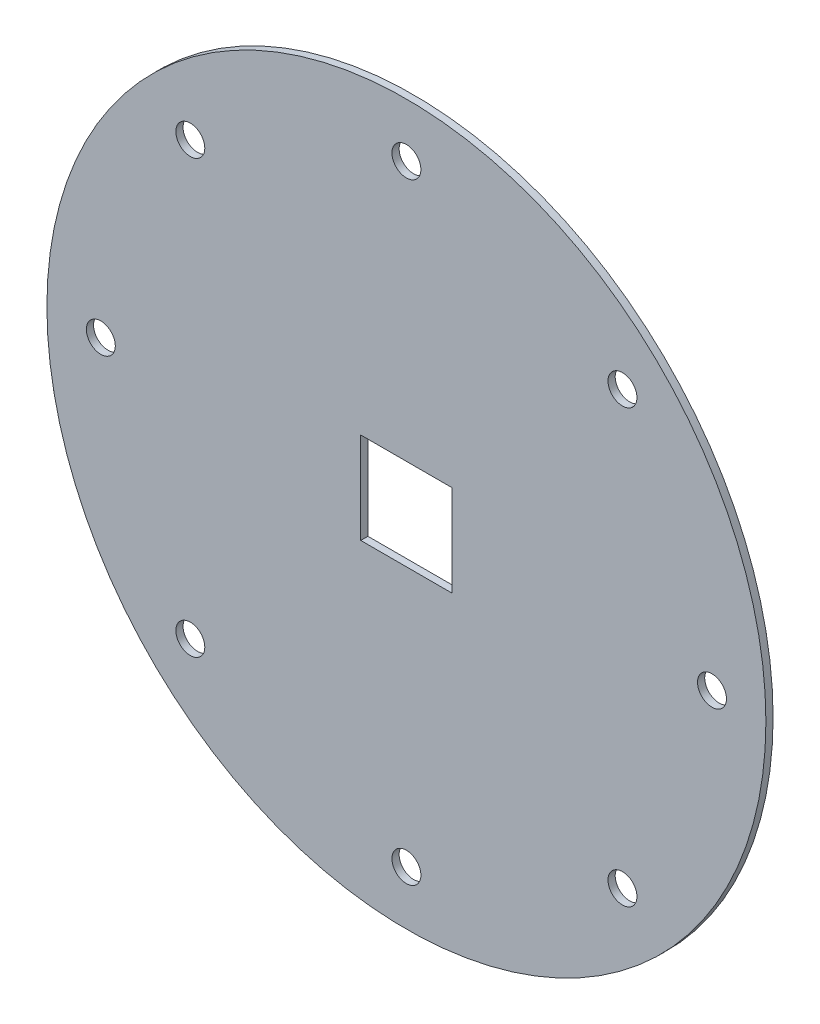
ISO-10303-21;
HEADER;
FILE_DESCRIPTION(('STEP AP214'),'2;1');
FILE_NAME('part.step','',(''),(''),'','','');
FILE_SCHEMA(('AUTOMOTIVE_DESIGN { 1 0 10303 214 1 1 1 1 }'));
ENDSEC;
DATA;
#1=APPLICATION_CONTEXT('core data for automotive mechanical design processes');
#2=APPLICATION_PROTOCOL_DEFINITION('international standard','automotive_design',2000,#1);
#3=PRODUCT_CONTEXT('',#1,'mechanical');
#4=PRODUCT('Part','Part','',(#3));
#5=PRODUCT_RELATED_PRODUCT_CATEGORY('part','',(#4));
#6=PRODUCT_DEFINITION_FORMATION('','',#4);
#7=PRODUCT_DEFINITION_CONTEXT('part definition',#1,'design');
#8=PRODUCT_DEFINITION('design','',#6,#7);
#9=PRODUCT_DEFINITION_SHAPE('','',#8);
#10=(LENGTH_UNIT() NAMED_UNIT(*) SI_UNIT(.MILLI.,.METRE.));
#11=(NAMED_UNIT(*) PLANE_ANGLE_UNIT() SI_UNIT($,.RADIAN.));
#12=(NAMED_UNIT(*) SI_UNIT($,.STERADIAN.) SOLID_ANGLE_UNIT());
#13=UNCERTAINTY_MEASURE_WITH_UNIT(LENGTH_MEASURE(1.E-05),#10,'distance_accuracy_value','');
#14=(GEOMETRIC_REPRESENTATION_CONTEXT(3) GLOBAL_UNCERTAINTY_ASSIGNED_CONTEXT((#13)) GLOBAL_UNIT_ASSIGNED_CONTEXT((#10,
#11,#12)) REPRESENTATION_CONTEXT('',''));
#15=CARTESIAN_POINT('',(0.,0.,0.));
#16=DIRECTION('',(0.,0.,1.));
#17=DIRECTION('',(1.,0.,0.));
#18=AXIS2_PLACEMENT_3D('',#15,#16,#17);
#19=CARTESIAN_POINT('',(0.,0.,2.));
#20=DIRECTION('',(0.,0.,1.));
#21=DIRECTION('',(1.,0.,0.));
#22=AXIS2_PLACEMENT_3D('',#19,#20,#21);
#23=PLANE('',#22);
#24=CARTESIAN_POINT('',(-84.9999999999928,-7.24233115585665E-12,2.));
#25=DIRECTION('',(0.,0.,1.));
#26=DIRECTION('',(1.,0.,0.));
#27=AXIS2_PLACEMENT_3D('',#24,#25,#26);
#28=CIRCLE('',#27,4.025);
#29=CARTESIAN_POINT('',(-80.9749999999928,-7.24233115585665E-12,2.));
#30=VERTEX_POINT('',#29);
#31=EDGE_CURVE('E166',#30,#30,#28,.T.);
#32=ORIENTED_EDGE('',*,*,#31,.F.);
#33=EDGE_LOOP('',(#32));
#34=FACE_BOUND('',#33,.T.);
#35=CARTESIAN_POINT('',(1.44638433161278E-11,-85.,2.));
#36=DIRECTION('',(0.,0.,1.));
#37=DIRECTION('',(1.,0.,0.));
#38=AXIS2_PLACEMENT_3D('',#35,#36,#37);
#39=CIRCLE('',#38,4.025);
#40=CARTESIAN_POINT('',(4.02500000001446,-85.,2.));
#41=VERTEX_POINT('',#40);
#42=EDGE_CURVE('E170',#41,#41,#39,.T.);
#43=ORIENTED_EDGE('',*,*,#42,.F.);
#44=EDGE_LOOP('',(#43));
#45=FACE_BOUND('',#44,.T.);
#46=CARTESIAN_POINT('',(85.0000000000072,7.23192165806389E-12,2.));
#47=DIRECTION('',(0.,0.,1.));
#48=DIRECTION('',(1.,0.,0.));
#49=AXIS2_PLACEMENT_3D('',#46,#47,#48);
#50=CIRCLE('',#49,4.025);
#51=CARTESIAN_POINT('',(89.0250000000072,7.23192165806389E-12,2.));
#52=VERTEX_POINT('',#51);
#53=EDGE_CURVE('E173',#52,#52,#50,.T.);
#54=ORIENTED_EDGE('',*,*,#53,.F.);
#55=EDGE_LOOP('',(#54));
#56=FACE_BOUND('',#55,.T.);
#57=DIRECTION('',(1.,0.,0.));
#58=VECTOR('',#57,1.);
#59=CARTESIAN_POINT('',(-12.7,-12.7,2.));
#60=LINE('',#59,#58);
#61=CARTESIAN_POINT('',(-12.7,-12.7,2.));
#62=VERTEX_POINT('',#61);
#63=CARTESIAN_POINT('',(12.7,-12.7,2.));
#64=VERTEX_POINT('',#63);
#65=EDGE_CURVE('E94',#62,#64,#60,.T.);
#66=ORIENTED_EDGE('',*,*,#65,.F.);
#67=DIRECTION('',(0.,-1.,0.));
#68=VECTOR('',#67,1.);
#69=CARTESIAN_POINT('',(-12.7,12.7,2.));
#70=LINE('',#69,#68);
#71=CARTESIAN_POINT('',(-12.7,12.7,2.));
#72=VERTEX_POINT('',#71);
#73=EDGE_CURVE('E85',#72,#62,#70,.T.);
#74=ORIENTED_EDGE('',*,*,#73,.F.);
#75=DIRECTION('',(-1.,0.,0.));
#76=VECTOR('',#75,1.);
#77=CARTESIAN_POINT('',(-12.7,12.7,2.));
#78=LINE('',#77,#76);
#79=CARTESIAN_POINT('',(12.7,12.7,2.));
#80=VERTEX_POINT('',#79);
#81=EDGE_CURVE('E112',#80,#72,#78,.T.);
#82=ORIENTED_EDGE('',*,*,#81,.F.);
#83=DIRECTION('',(0.,1.,0.));
#84=VECTOR('',#83,1.);
#85=CARTESIAN_POINT('',(12.7,12.7,2.));
#86=LINE('',#85,#84);
#87=EDGE_CURVE('E108',#64,#80,#86,.T.);
#88=ORIENTED_EDGE('',*,*,#87,.F.);
#89=EDGE_LOOP('',(#66,#74,#82,#88));
#90=FACE_BOUND('',#89,.T.);
#91=CARTESIAN_POINT('',(0.,85.,2.));
#92=DIRECTION('',(0.,0.,1.));
#93=DIRECTION('',(1.,0.,0.));
#94=AXIS2_PLACEMENT_3D('',#91,#92,#93);
#95=CIRCLE('',#94,4.025);
#96=CARTESIAN_POINT('',(4.025,85.,2.));
#97=VERTEX_POINT('',#96);
#98=EDGE_CURVE('E136',#97,#97,#95,.T.);
#99=ORIENTED_EDGE('',*,*,#98,.F.);
#100=EDGE_LOOP('',(#99));
#101=FACE_BOUND('',#100,.T.);
#102=CARTESIAN_POINT('',(0.,0.,2.));
#103=DIRECTION('',(0.,0.,1.));
#104=DIRECTION('',(1.,0.,0.));
#105=AXIS2_PLACEMENT_3D('',#102,#103,#104);
#106=CIRCLE('',#105,100.);
#107=CARTESIAN_POINT('',(100.,0.,2.));
#108=VERTEX_POINT('',#107);
#109=EDGE_CURVE('E11',#108,#108,#106,.T.);
#110=ORIENTED_EDGE('',*,*,#109,.T.);
#111=EDGE_LOOP('',(#110));
#112=FACE_BOUND('',#111,.T.);
#113=CARTESIAN_POINT('',(60.1040764008587,60.1040764008617,2.));
#114=DIRECTION('',(0.,0.,1.));
#115=DIRECTION('',(1.,0.,0.));
#116=AXIS2_PLACEMENT_3D('',#113,#114,#115);
#117=CIRCLE('',#116,4.025);
#118=CARTESIAN_POINT('',(64.1290764008587,60.1040764008617,2.));
#119=VERTEX_POINT('',#118);
#120=EDGE_CURVE('E120',#119,#119,#117,.T.);
#121=ORIENTED_EDGE('',*,*,#120,.F.);
#122=EDGE_LOOP('',(#121));
#123=FACE_BOUND('',#122,.T.);
#124=CARTESIAN_POINT('',(60.1040764008689,-60.1040764008514,2.));
#125=DIRECTION('',(0.,0.,1.));
#126=DIRECTION('',(1.,0.,0.));
#127=AXIS2_PLACEMENT_3D('',#124,#125,#126);
#128=CIRCLE('',#127,4.025);
#129=CARTESIAN_POINT('',(64.1290764008689,-60.1040764008514,2.));
#130=VERTEX_POINT('',#129);
#131=EDGE_CURVE('E183',#130,#130,#128,.T.);
#132=ORIENTED_EDGE('',*,*,#131,.F.);
#133=EDGE_LOOP('',(#132));
#134=FACE_BOUND('',#133,.T.);
#135=CARTESIAN_POINT('',(-60.1040764008442,-60.1040764008617,2.));
#136=DIRECTION('',(0.,0.,1.));
#137=DIRECTION('',(1.,0.,0.));
#138=AXIS2_PLACEMENT_3D('',#135,#136,#137);
#139=CIRCLE('',#138,4.025);
#140=CARTESIAN_POINT('',(-56.0790764008442,-60.1040764008617,2.));
#141=VERTEX_POINT('',#140);
#142=EDGE_CURVE('E203',#141,#141,#139,.T.);
#143=ORIENTED_EDGE('',*,*,#142,.F.);
#144=EDGE_LOOP('',(#143));
#145=FACE_BOUND('',#144,.T.);
#146=CARTESIAN_POINT('',(-60.1040764008544,60.1040764008514,2.));
#147=DIRECTION('',(0.,0.,1.));
#148=DIRECTION('',(1.,0.,0.));
#149=AXIS2_PLACEMENT_3D('',#146,#147,#148);
#150=CIRCLE('',#149,4.025);
#151=CARTESIAN_POINT('',(-56.0790764008544,60.1040764008514,2.));
#152=VERTEX_POINT('',#151);
#153=EDGE_CURVE('E206',#152,#152,#150,.T.);
#154=ORIENTED_EDGE('',*,*,#153,.F.);
#155=EDGE_LOOP('',(#154));
#156=FACE_BOUND('',#155,.T.);
#157=ADVANCED_FACE('F43',(#34,#45,#56,#90,#101,#112,#123,#134,#145,#156),#23,.T.);
#158=CARTESIAN_POINT('',(0.,0.,0.));
#159=DIRECTION('',(0.,0.,1.));
#160=DIRECTION('',(1.,0.,0.));
#161=AXIS2_PLACEMENT_3D('',#158,#159,#160);
#162=PLANE('',#161);
#163=CARTESIAN_POINT('',(0.,85.,0.));
#164=DIRECTION('',(0.,0.,1.));
#165=DIRECTION('',(1.,0.,0.));
#166=AXIS2_PLACEMENT_3D('',#163,#164,#165);
#167=CIRCLE('',#166,4.025);
#168=CARTESIAN_POINT('',(4.025,85.,0.));
#169=VERTEX_POINT('',#168);
#170=EDGE_CURVE('E103',#169,#169,#167,.T.);
#171=ORIENTED_EDGE('',*,*,#170,.T.);
#172=EDGE_LOOP('',(#171));
#173=FACE_BOUND('',#172,.T.);
#174=CARTESIAN_POINT('',(0.,0.,0.));
#175=DIRECTION('',(0.,0.,1.));
#176=DIRECTION('',(1.,0.,0.));
#177=AXIS2_PLACEMENT_3D('',#174,#175,#176);
#178=CIRCLE('',#177,100.);
#179=CARTESIAN_POINT('',(100.,0.,0.));
#180=VERTEX_POINT('',#179);
#181=EDGE_CURVE('E47',#180,#180,#178,.T.);
#182=ORIENTED_EDGE('',*,*,#181,.F.);
#183=EDGE_LOOP('',(#182));
#184=FACE_BOUND('',#183,.T.);
#185=DIRECTION('',(0.,-1.,0.));
#186=VECTOR('',#185,1.);
#187=CARTESIAN_POINT('',(-12.7,12.7,0.));
#188=LINE('',#187,#186);
#189=CARTESIAN_POINT('',(-12.7,12.7,0.));
#190=VERTEX_POINT('',#189);
#191=CARTESIAN_POINT('',(-12.7,-12.7,0.));
#192=VERTEX_POINT('',#191);
#193=EDGE_CURVE('E67',#190,#192,#188,.T.);
#194=ORIENTED_EDGE('',*,*,#193,.T.);
#195=DIRECTION('',(1.,0.,0.));
#196=VECTOR('',#195,1.);
#197=CARTESIAN_POINT('',(-12.7,-12.7,0.));
#198=LINE('',#197,#196);
#199=CARTESIAN_POINT('',(12.7,-12.7,0.));
#200=VERTEX_POINT('',#199);
#201=EDGE_CURVE('E101',#192,#200,#198,.T.);
#202=ORIENTED_EDGE('',*,*,#201,.T.);
#203=DIRECTION('',(0.,1.,0.));
#204=VECTOR('',#203,1.);
#205=CARTESIAN_POINT('',(12.7,12.7,0.));
#206=LINE('',#205,#204);
#207=CARTESIAN_POINT('',(12.7,12.7,0.));
#208=VERTEX_POINT('',#207);
#209=EDGE_CURVE('E123',#200,#208,#206,.T.);
#210=ORIENTED_EDGE('',*,*,#209,.T.);
#211=DIRECTION('',(-1.,0.,0.));
#212=VECTOR('',#211,1.);
#213=CARTESIAN_POINT('',(-12.7,12.7,0.));
#214=LINE('',#213,#212);
#215=EDGE_CURVE('E95',#208,#190,#214,.T.);
#216=ORIENTED_EDGE('',*,*,#215,.T.);
#217=EDGE_LOOP('',(#194,#202,#210,#216));
#218=FACE_BOUND('',#217,.T.);
#219=CARTESIAN_POINT('',(60.1040764008587,60.1040764008617,0.));
#220=DIRECTION('',(0.,0.,1.));
#221=DIRECTION('',(1.,0.,0.));
#222=AXIS2_PLACEMENT_3D('',#219,#220,#221);
#223=CIRCLE('',#222,4.025);
#224=CARTESIAN_POINT('',(64.1290764008587,60.1040764008617,0.));
#225=VERTEX_POINT('',#224);
#226=EDGE_CURVE('E176',#225,#225,#223,.T.);
#227=ORIENTED_EDGE('',*,*,#226,.T.);
#228=EDGE_LOOP('',(#227));
#229=FACE_BOUND('',#228,.T.);
#230=CARTESIAN_POINT('',(85.0000000000072,7.23192165806389E-12,0.));
#231=DIRECTION('',(0.,0.,1.));
#232=DIRECTION('',(1.,0.,0.));
#233=AXIS2_PLACEMENT_3D('',#230,#231,#232);
#234=CIRCLE('',#233,4.025);
#235=CARTESIAN_POINT('',(89.0250000000072,7.23192165806389E-12,0.));
#236=VERTEX_POINT('',#235);
#237=EDGE_CURVE('E177',#236,#236,#234,.T.);
#238=ORIENTED_EDGE('',*,*,#237,.T.);
#239=EDGE_LOOP('',(#238));
#240=FACE_BOUND('',#239,.T.);
#241=CARTESIAN_POINT('',(60.1040764008689,-60.1040764008514,0.));
#242=DIRECTION('',(0.,0.,1.));
#243=DIRECTION('',(1.,0.,0.));
#244=AXIS2_PLACEMENT_3D('',#241,#242,#243);
#245=CIRCLE('',#244,4.025);
#246=CARTESIAN_POINT('',(64.1290764008689,-60.1040764008514,0.));
#247=VERTEX_POINT('',#246);
#248=EDGE_CURVE('E186',#247,#247,#245,.T.);
#249=ORIENTED_EDGE('',*,*,#248,.T.);
#250=EDGE_LOOP('',(#249));
#251=FACE_BOUND('',#250,.T.);
#252=CARTESIAN_POINT('',(1.44638433161278E-11,-85.,0.));
#253=DIRECTION('',(0.,0.,1.));
#254=DIRECTION('',(1.,0.,0.));
#255=AXIS2_PLACEMENT_3D('',#252,#253,#254);
#256=CIRCLE('',#255,4.025);
#257=CARTESIAN_POINT('',(4.02500000001446,-85.,0.));
#258=VERTEX_POINT('',#257);
#259=EDGE_CURVE('E224',#258,#258,#256,.T.);
#260=ORIENTED_EDGE('',*,*,#259,.T.);
#261=EDGE_LOOP('',(#260));
#262=FACE_BOUND('',#261,.T.);
#263=CARTESIAN_POINT('',(-60.1040764008442,-60.1040764008617,0.));
#264=DIRECTION('',(0.,0.,1.));
#265=DIRECTION('',(1.,0.,0.));
#266=AXIS2_PLACEMENT_3D('',#263,#264,#265);
#267=CIRCLE('',#266,4.025);
#268=CARTESIAN_POINT('',(-56.0790764008442,-60.1040764008617,0.));
#269=VERTEX_POINT('',#268);
#270=EDGE_CURVE('E220',#269,#269,#267,.T.);
#271=ORIENTED_EDGE('',*,*,#270,.T.);
#272=EDGE_LOOP('',(#271));
#273=FACE_BOUND('',#272,.T.);
#274=CARTESIAN_POINT('',(-84.9999999999928,-7.24233115585665E-12,0.));
#275=DIRECTION('',(0.,0.,1.));
#276=DIRECTION('',(1.,0.,0.));
#277=AXIS2_PLACEMENT_3D('',#274,#275,#276);
#278=CIRCLE('',#277,4.025);
#279=CARTESIAN_POINT('',(-80.9749999999928,-7.24233115585665E-12,0.));
#280=VERTEX_POINT('',#279);
#281=EDGE_CURVE('E209',#280,#280,#278,.T.);
#282=ORIENTED_EDGE('',*,*,#281,.T.);
#283=EDGE_LOOP('',(#282));
#284=FACE_BOUND('',#283,.T.);
#285=CARTESIAN_POINT('',(-60.1040764008544,60.1040764008514,0.));
#286=DIRECTION('',(0.,0.,1.));
#287=DIRECTION('',(1.,0.,0.));
#288=AXIS2_PLACEMENT_3D('',#285,#286,#287);
#289=CIRCLE('',#288,4.025);
#290=CARTESIAN_POINT('',(-56.0790764008544,60.1040764008514,0.));
#291=VERTEX_POINT('',#290);
#292=EDGE_CURVE('E210',#291,#291,#289,.T.);
#293=ORIENTED_EDGE('',*,*,#292,.T.);
#294=EDGE_LOOP('',(#293));
#295=FACE_BOUND('',#294,.T.);
#296=ADVANCED_FACE('F144',(#173,#184,#218,#229,#240,#251,#262,#273,#284,#295),#162,.F.);
#297=CARTESIAN_POINT('',(0.,0.,2.));
#298=DIRECTION('',(0.,0.,-1.));
#299=DIRECTION('',(-1.,0.,0.));
#300=AXIS2_PLACEMENT_3D('',#297,#298,#299);
#301=CYLINDRICAL_SURFACE('',#300,100.);
#302=ORIENTED_EDGE('',*,*,#109,.F.);
#303=EDGE_LOOP('',(#302));
#304=FACE_BOUND('',#303,.T.);
#305=ORIENTED_EDGE('',*,*,#181,.T.);
#306=EDGE_LOOP('',(#305));
#307=FACE_BOUND('',#306,.T.);
#308=ADVANCED_FACE('F45',(#304,#307),#301,.T.);
#309=CARTESIAN_POINT('',(0.,85.,2.));
#310=DIRECTION('',(0.,0.,-1.));
#311=DIRECTION('',(-1.,0.,0.));
#312=AXIS2_PLACEMENT_3D('',#309,#310,#311);
#313=CYLINDRICAL_SURFACE('',#312,4.025);
#314=ORIENTED_EDGE('',*,*,#98,.T.);
#315=EDGE_LOOP('',(#314));
#316=FACE_BOUND('',#315,.T.);
#317=ORIENTED_EDGE('',*,*,#170,.F.);
#318=EDGE_LOOP('',(#317));
#319=FACE_BOUND('',#318,.T.);
#320=ADVANCED_FACE('F147',(#316,#319),#313,.F.);
#321=CARTESIAN_POINT('',(-12.7,12.7,2.));
#322=DIRECTION('',(1.,0.,0.));
#323=DIRECTION('',(0.,1.,0.));
#324=AXIS2_PLACEMENT_3D('',#321,#322,#323);
#325=PLANE('',#324);
#326=ORIENTED_EDGE('',*,*,#193,.F.);
#327=DIRECTION('',(0.,0.,-1.));
#328=VECTOR('',#327,1.);
#329=CARTESIAN_POINT('',(-12.7,12.7,2.));
#330=LINE('',#329,#328);
#331=EDGE_CURVE('E89',#72,#190,#330,.T.);
#332=ORIENTED_EDGE('',*,*,#331,.F.);
#333=ORIENTED_EDGE('',*,*,#73,.T.);
#334=DIRECTION('',(0.,0.,-1.));
#335=VECTOR('',#334,1.);
#336=CARTESIAN_POINT('',(-12.7,-12.7,2.));
#337=LINE('',#336,#335);
#338=EDGE_CURVE('E88',#62,#192,#337,.T.);
#339=ORIENTED_EDGE('',*,*,#338,.T.);
#340=EDGE_LOOP('',(#326,#332,#333,#339));
#341=FACE_BOUND('',#340,.T.);
#342=ADVANCED_FACE('F87',(#341),#325,.T.);
#343=CARTESIAN_POINT('',(-12.7,-12.7,2.));
#344=DIRECTION('',(0.,1.,0.));
#345=DIRECTION('',(-1.,0.,0.));
#346=AXIS2_PLACEMENT_3D('',#343,#344,#345);
#347=PLANE('',#346);
#348=ORIENTED_EDGE('',*,*,#201,.F.);
#349=ORIENTED_EDGE('',*,*,#338,.F.);
#350=ORIENTED_EDGE('',*,*,#65,.T.);
#351=DIRECTION('',(0.,0.,-1.));
#352=VECTOR('',#351,1.);
#353=CARTESIAN_POINT('',(12.7,-12.7,2.));
#354=LINE('',#353,#352);
#355=EDGE_CURVE('E104',#64,#200,#354,.T.);
#356=ORIENTED_EDGE('',*,*,#355,.T.);
#357=EDGE_LOOP('',(#348,#349,#350,#356));
#358=FACE_BOUND('',#357,.T.);
#359=ADVANCED_FACE('F98',(#358),#347,.T.);
#360=CARTESIAN_POINT('',(12.7,12.7,2.));
#361=DIRECTION('',(-1.,0.,0.));
#362=DIRECTION('',(0.,0.,1.));
#363=AXIS2_PLACEMENT_3D('',#360,#361,#362);
#364=PLANE('',#363);
#365=ORIENTED_EDGE('',*,*,#209,.F.);
#366=ORIENTED_EDGE('',*,*,#355,.F.);
#367=ORIENTED_EDGE('',*,*,#87,.T.);
#368=DIRECTION('',(0.,0.,-1.));
#369=VECTOR('',#368,1.);
#370=CARTESIAN_POINT('',(12.7,12.7,2.));
#371=LINE('',#370,#369);
#372=EDGE_CURVE('E59',#80,#208,#371,.T.);
#373=ORIENTED_EDGE('',*,*,#372,.T.);
#374=EDGE_LOOP('',(#365,#366,#367,#373));
#375=FACE_BOUND('',#374,.T.);
#376=ADVANCED_FACE('F260',(#375),#364,.T.);
#377=CARTESIAN_POINT('',(-12.7,12.7,2.));
#378=DIRECTION('',(0.,-1.,0.));
#379=DIRECTION('',(1.,0.,0.));
#380=AXIS2_PLACEMENT_3D('',#377,#378,#379);
#381=PLANE('',#380);
#382=ORIENTED_EDGE('',*,*,#215,.F.);
#383=ORIENTED_EDGE('',*,*,#372,.F.);
#384=ORIENTED_EDGE('',*,*,#81,.T.);
#385=ORIENTED_EDGE('',*,*,#331,.T.);
#386=EDGE_LOOP('',(#382,#383,#384,#385));
#387=FACE_BOUND('',#386,.T.);
#388=ADVANCED_FACE('F257',(#387),#381,.T.);
#389=CARTESIAN_POINT('',(60.1040764008587,60.1040764008617,2.));
#390=DIRECTION('',(0.,0.,-1.));
#391=DIRECTION('',(-1.,0.,0.));
#392=AXIS2_PLACEMENT_3D('',#389,#390,#391);
#393=CYLINDRICAL_SURFACE('',#392,4.025);
#394=ORIENTED_EDGE('',*,*,#120,.T.);
#395=EDGE_LOOP('',(#394));
#396=FACE_BOUND('',#395,.T.);
#397=ORIENTED_EDGE('',*,*,#226,.F.);
#398=EDGE_LOOP('',(#397));
#399=FACE_BOUND('',#398,.T.);
#400=ADVANCED_FACE('F193',(#396,#399),#393,.F.);
#401=CARTESIAN_POINT('',(85.0000000000072,7.23192165806389E-12,2.));
#402=DIRECTION('',(0.,0.,-1.));
#403=DIRECTION('',(-1.,0.,0.));
#404=AXIS2_PLACEMENT_3D('',#401,#402,#403);
#405=CYLINDRICAL_SURFACE('',#404,4.025);
#406=ORIENTED_EDGE('',*,*,#53,.T.);
#407=EDGE_LOOP('',(#406));
#408=FACE_BOUND('',#407,.T.);
#409=ORIENTED_EDGE('',*,*,#237,.F.);
#410=EDGE_LOOP('',(#409));
#411=FACE_BOUND('',#410,.T.);
#412=ADVANCED_FACE('F243',(#408,#411),#405,.F.);
#413=CARTESIAN_POINT('',(60.1040764008689,-60.1040764008514,2.));
#414=DIRECTION('',(0.,0.,-1.));
#415=DIRECTION('',(-1.,0.,0.));
#416=AXIS2_PLACEMENT_3D('',#413,#414,#415);
#417=CYLINDRICAL_SURFACE('',#416,4.025);
#418=ORIENTED_EDGE('',*,*,#131,.T.);
#419=EDGE_LOOP('',(#418));
#420=FACE_BOUND('',#419,.T.);
#421=ORIENTED_EDGE('',*,*,#248,.F.);
#422=EDGE_LOOP('',(#421));
#423=FACE_BOUND('',#422,.T.);
#424=ADVANCED_FACE('F240',(#420,#423),#417,.F.);
#425=CARTESIAN_POINT('',(1.44638433161278E-11,-85.,2.));
#426=DIRECTION('',(0.,0.,-1.));
#427=DIRECTION('',(-1.,0.,0.));
#428=AXIS2_PLACEMENT_3D('',#425,#426,#427);
#429=CYLINDRICAL_SURFACE('',#428,4.025);
#430=ORIENTED_EDGE('',*,*,#42,.T.);
#431=EDGE_LOOP('',(#430));
#432=FACE_BOUND('',#431,.T.);
#433=ORIENTED_EDGE('',*,*,#259,.F.);
#434=EDGE_LOOP('',(#433));
#435=FACE_BOUND('',#434,.T.);
#436=ADVANCED_FACE('F242',(#432,#435),#429,.F.);
#437=CARTESIAN_POINT('',(-60.1040764008442,-60.1040764008617,2.));
#438=DIRECTION('',(0.,0.,-1.));
#439=DIRECTION('',(-1.,0.,0.));
#440=AXIS2_PLACEMENT_3D('',#437,#438,#439);
#441=CYLINDRICAL_SURFACE('',#440,4.025);
#442=ORIENTED_EDGE('',*,*,#142,.T.);
#443=EDGE_LOOP('',(#442));
#444=FACE_BOUND('',#443,.T.);
#445=ORIENTED_EDGE('',*,*,#270,.F.);
#446=EDGE_LOOP('',(#445));
#447=FACE_BOUND('',#446,.T.);
#448=ADVANCED_FACE('F249',(#444,#447),#441,.F.);
#449=CARTESIAN_POINT('',(-84.9999999999928,-7.24233115585665E-12,2.));
#450=DIRECTION('',(0.,0.,-1.));
#451=DIRECTION('',(-1.,0.,0.));
#452=AXIS2_PLACEMENT_3D('',#449,#450,#451);
#453=CYLINDRICAL_SURFACE('',#452,4.025);
#454=ORIENTED_EDGE('',*,*,#31,.T.);
#455=EDGE_LOOP('',(#454));
#456=FACE_BOUND('',#455,.T.);
#457=ORIENTED_EDGE('',*,*,#281,.F.);
#458=EDGE_LOOP('',(#457));
#459=FACE_BOUND('',#458,.T.);
#460=ADVANCED_FACE('F307',(#456,#459),#453,.F.);
#461=CARTESIAN_POINT('',(-60.1040764008544,60.1040764008514,2.));
#462=DIRECTION('',(0.,0.,-1.));
#463=DIRECTION('',(-1.,0.,0.));
#464=AXIS2_PLACEMENT_3D('',#461,#462,#463);
#465=CYLINDRICAL_SURFACE('',#464,4.025);
#466=ORIENTED_EDGE('',*,*,#153,.T.);
#467=EDGE_LOOP('',(#466));
#468=FACE_BOUND('',#467,.T.);
#469=ORIENTED_EDGE('',*,*,#292,.F.);
#470=EDGE_LOOP('',(#469));
#471=FACE_BOUND('',#470,.T.);
#472=ADVANCED_FACE('F317',(#468,#471),#465,.F.);
#473=CLOSED_SHELL('',(#157,#296,#308,#320,#342,#359,#376,#388,#400,#412,#424,#436,#448,#460,#472));
#474=MANIFOLD_SOLID_BREP('B2',#473);
#475=ADVANCED_BREP_SHAPE_REPRESENTATION('',(#18,#474),#14);
#476=SHAPE_DEFINITION_REPRESENTATION(#9,#475);
ENDSEC;
END-ISO-10303-21;
